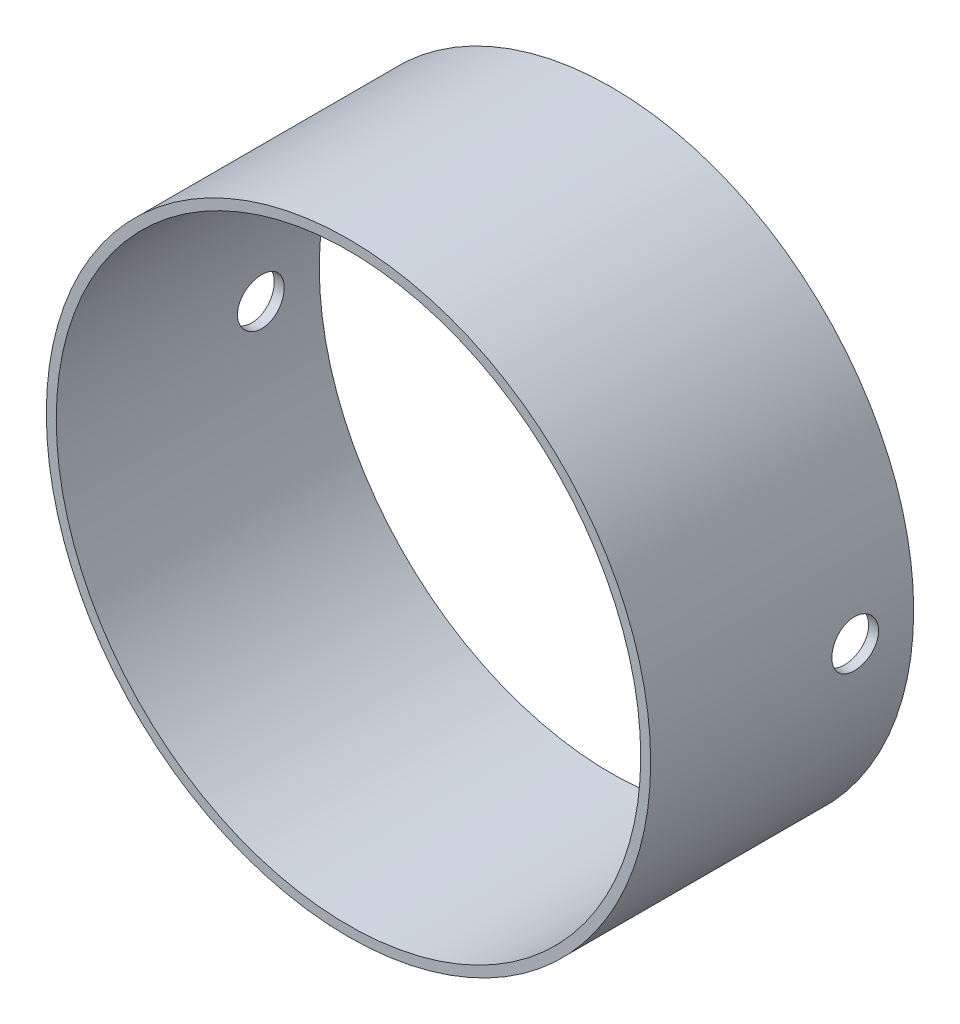
ISO-10303-21;
HEADER;
FILE_DESCRIPTION(('STEP AP214'),'2;1');
FILE_NAME('part.step','',(''),(''),'','','');
FILE_SCHEMA(('AUTOMOTIVE_DESIGN { 1 0 10303 214 1 1 1 1 }'));
ENDSEC;
DATA;
#1=APPLICATION_CONTEXT('core data for automotive mechanical design processes');
#2=APPLICATION_PROTOCOL_DEFINITION('international standard','automotive_design',2000,#1);
#3=PRODUCT_CONTEXT('',#1,'mechanical');
#4=PRODUCT('Part','Part','',(#3));
#5=PRODUCT_RELATED_PRODUCT_CATEGORY('part','',(#4));
#6=PRODUCT_DEFINITION_FORMATION('','',#4);
#7=PRODUCT_DEFINITION_CONTEXT('part definition',#1,'design');
#8=PRODUCT_DEFINITION('design','',#6,#7);
#9=PRODUCT_DEFINITION_SHAPE('','',#8);
#10=(LENGTH_UNIT() NAMED_UNIT(*) SI_UNIT(.MILLI.,.METRE.));
#11=(NAMED_UNIT(*) PLANE_ANGLE_UNIT() SI_UNIT($,.RADIAN.));
#12=(NAMED_UNIT(*) SI_UNIT($,.STERADIAN.) SOLID_ANGLE_UNIT());
#13=UNCERTAINTY_MEASURE_WITH_UNIT(LENGTH_MEASURE(1.E-05),#10,'distance_accuracy_value','');
#14=(GEOMETRIC_REPRESENTATION_CONTEXT(3) GLOBAL_UNCERTAINTY_ASSIGNED_CONTEXT((#13)) GLOBAL_UNIT_ASSIGNED_CONTEXT((#10,
#11,#12)) REPRESENTATION_CONTEXT('',''));
#15=CARTESIAN_POINT('',(0.,0.,0.));
#16=DIRECTION('',(0.,0.,1.));
#17=DIRECTION('',(1.,0.,0.));
#18=AXIS2_PLACEMENT_3D('',#15,#16,#17);
#19=CARTESIAN_POINT('',(0.,0.,-10.));
#20=DIRECTION('',(0.,0.,1.));
#21=DIRECTION('',(1.,0.,0.));
#22=AXIS2_PLACEMENT_3D('',#19,#20,#21);
#23=CYLINDRICAL_SURFACE('',#22,51.7);
#24=CARTESIAN_POINT('',(51.7,0.,4.));
#25=CARTESIAN_POINT('',(51.6999979631389,-0.224321831586067,3.99999017819331));
#26=CARTESIAN_POINT('',(51.6985244508103,-0.448797748586467,3.98106643990332));
#27=CARTESIAN_POINT('',(51.6927879875289,-0.89154273163051,3.90585232373644));
#28=CARTESIAN_POINT('',(51.6885218491458,-1.10980440749991,3.84951924675469));
#29=CARTESIAN_POINT('',(51.6776823923995,-1.53364423028132,3.70112174179197));
#30=CARTESIAN_POINT('',(51.6711103518839,-1.73922932805746,3.60907710088652));
#31=CARTESIAN_POINT('',(51.6563967875411,-2.13198086111805,3.39190366394527));
#32=CARTESIAN_POINT('',(51.6482556069983,-2.31915131151363,3.26678210200226));
#33=CARTESIAN_POINT('',(51.6312976090086,-2.67022618829929,2.98670591245437));
#34=CARTESIAN_POINT('',(51.622479496011,-2.83408419814187,2.83169317521165));
#35=CARTESIAN_POINT('',(51.6051724138657,-3.13348492470818,2.4963570088799));
#36=CARTESIAN_POINT('',(51.5966834589622,-3.26902641716669,2.31603248599858));
#37=CARTESIAN_POINT('',(51.5809815284847,-3.50810040018891,1.93491472332168));
#38=CARTESIAN_POINT('',(51.5737701627781,-3.61159262709083,1.73409615424683));
#39=CARTESIAN_POINT('',(51.5614540963383,-3.78337303081082,1.31786762642153));
#40=CARTESIAN_POINT('',(51.5563493630073,-3.85166175236816,1.10245789351319));
#41=CARTESIAN_POINT('',(51.5488349906361,-3.95096340232216,0.663622767820182));
#42=CARTESIAN_POINT('',(51.5464199322672,-3.98205129477393,0.440214432561678));
#43=CARTESIAN_POINT('',(51.5445410588577,-4.00630035100804,-0.00866144232712456));
#44=CARTESIAN_POINT('',(51.5450771953681,-3.9994621374124,-0.234128948091945));
#45=CARTESIAN_POINT('',(51.5490352256421,-3.94811511582786,-0.680210175421947));
#46=CARTESIAN_POINT('',(51.5524508869763,-3.9036876650494,-0.900833324776028));
#47=CARTESIAN_POINT('',(51.5617733022188,-3.77854963493722,-1.33148163210521));
#48=CARTESIAN_POINT('',(51.5676800775053,-3.69783874422861,-1.54150669911316));
#49=CARTESIAN_POINT('',(51.581326319149,-3.50233342665419,-1.94525695354622));
#50=CARTESIAN_POINT('',(51.5890677532469,-3.38750237083385,-2.13896433517158));
#51=CARTESIAN_POINT('',(51.6055091454228,-3.1270427974008,-2.50438588326941));
#52=CARTESIAN_POINT('',(51.614209120192,-2.98141374345625,-2.67609966665067));
#53=CARTESIAN_POINT('',(51.6316149923809,-2.66303513763778,-2.99313283619144));
#54=CARTESIAN_POINT('',(51.6403208451428,-2.49021522816072,-3.13838157800364));
#55=CARTESIAN_POINT('',(51.6567356282362,-2.12260646352011,-3.39781579055553));
#56=CARTESIAN_POINT('',(51.6644445580159,-1.92781759619756,-3.51200124410273));
#57=CARTESIAN_POINT('',(51.6779980627435,-1.52175530011905,-3.70606268143635));
#58=CARTESIAN_POINT('',(51.6838424754255,-1.31048043860398,-3.78593567927473));
#59=CARTESIAN_POINT('',(51.6930064775433,-0.877463930530638,-3.90905616202351));
#60=CARTESIAN_POINT('',(51.6963261121438,-0.655722471280415,-3.95230430210259));
#61=CARTESIAN_POINT('',(51.7000607166855,-0.208679711334541,-4.00085916917402));
#62=CARTESIAN_POINT('',(51.700483159093,0.0166109281094598,-4.00626350403786));
#63=CARTESIAN_POINT('',(51.6983957123466,0.464895177310392,-3.97923284061434));
#64=CARTESIAN_POINT('',(51.6958858467189,0.687888805482089,-3.94679814591488));
#65=CARTESIAN_POINT('',(51.6882209414929,1.12497180803664,-3.84509100035149));
#66=CARTESIAN_POINT('',(51.6830691404631,1.33907173804802,-3.7758636473271));
#67=CARTESIAN_POINT('',(51.6706993646632,1.75261644172726,-3.60258227299288));
#68=CARTESIAN_POINT('',(51.6634813616147,1.9520610147717,-3.49852777502774));
#69=CARTESIAN_POINT('',(51.6477702788731,2.33107858629529,-3.2582995400215));
#70=CARTESIAN_POINT('',(51.639274638291,2.51061038659817,-3.12206097303457));
#71=CARTESIAN_POINT('',(51.6219718914661,2.84429065387553,-2.82142578532332));
#72=CARTESIAN_POINT('',(51.6131647805584,2.99843874047784,-2.65702874272262));
#73=CARTESIAN_POINT('',(51.5962097247143,3.27730938791167,-2.30432043397325));
#74=CARTESIAN_POINT('',(51.5880632284561,3.40196837018899,-2.11595881987407));
#75=CARTESIAN_POINT('',(51.5733716018661,3.61788660029925,-1.72091962403499));
#76=CARTESIAN_POINT('',(51.5668264574495,3.7091461418991,-1.51424220341279));
#77=CARTESIAN_POINT('',(51.5560862667062,3.85556609378882,-1.08866556542602));
#78=CARTESIAN_POINT('',(51.5518886649328,3.91076576854148,-0.869779924139971));
#79=CARTESIAN_POINT('',(51.5463099727251,3.98362703629687,-0.425813470015094));
#80=CARTESIAN_POINT('',(51.5449288364902,4.00128923972315,-0.200732757979016));
#81=CARTESIAN_POINT('',(51.5451399926833,3.9985675595747,0.24860273027963));
#82=CARTESIAN_POINT('',(51.546724476832,3.97828358580493,0.472858122128244));
#83=CARTESIAN_POINT('',(51.5526717636343,3.90045330050061,0.91476757537473));
#84=CARTESIAN_POINT('',(51.5570345708104,3.8429069283109,1.13242162602643));
#85=CARTESIAN_POINT('',(51.5680448938241,3.69220988670597,1.55495899160377));
#86=CARTESIAN_POINT('',(51.5746923194864,3.59906062254085,1.7598428102007));
#87=CARTESIAN_POINT('',(51.5895229558259,3.37981369300315,2.15107949634457));
#88=CARTESIAN_POINT('',(51.5977061374797,3.25371665027832,2.33743271399128));
#89=CARTESIAN_POINT('',(51.6147117356231,2.97177904342511,2.68682879318712));
#90=CARTESIAN_POINT('',(51.6235357004448,2.81586484097398,2.84981215782555));
#91=CARTESIAN_POINT('',(51.6408146053577,2.47884533918228,3.14735751690086));
#92=CARTESIAN_POINT('',(51.649269455333,2.29773393288346,3.28191260130306));
#93=CARTESIAN_POINT('',(51.6648706384483,1.91515779363153,3.51893613312878));
#94=CARTESIAN_POINT('',(51.6720147743368,1.71365974640222,3.62135090177173));
#95=CARTESIAN_POINT('',(51.6841628980158,1.29641290866476,3.79076504479149));
#96=CARTESIAN_POINT('',(51.6891693592603,1.08068092358888,3.85780537142457));
#97=CARTESIAN_POINT('',(51.6951843410166,0.719717539238049,3.93738283901144));
#98=CARTESIAN_POINT('',(51.6969820539609,0.576811481254393,3.96083333305749));
#99=CARTESIAN_POINT('',(51.6993905389704,0.28929164456306,3.99214506345849));
#100=CARTESIAN_POINT('',(51.7000013136873,0.144677869671184,4.00000633464009));
#101=CARTESIAN_POINT('',(51.7,0.,4.));
#102=B_SPLINE_CURVE_WITH_KNOTS('',3,(#24,#25,#26,#27,#28,#29,#30,#31,#32,#33,#34,#35,#36,#37,
#38,#39,#40,#41,#42,#43,#44,#45,#46,#47,#48,#49,#50,#51,#52,#53,#54,#55,#56,#57,#58,#59,#60,#61,
#62,#63,#64,#65,#66,#67,#68,#69,#70,#71,#72,#73,#74,#75,#76,#77,#78,#79,#80,#81,#82,#83,#84,#85,
#86,#87,#88,#89,#90,#91,#92,#93,#94,#95,#96,#97,#98,#99,#100,#101),.UNSPECIFIED.,.T.,.F.,(4,2,2,
2,2,2,2,2,2,2,2,2,2,2,2,2,2,2,2,2,2,2,2,2,2,2,2,2,2,2,2,2,2,2,2,2,2,2,4),(0.,0.672437285542166,
1.34564341478563,2.01847706522499,2.69116368504895,3.3651714643236,4.0392083783108,
4.71408868496265,5.38895854819879,6.06246616658467,6.7359627282218,7.40800530863907,
8.08005365645846,8.75282608980142,9.42561024010679,10.100164782686,10.774719698608,
11.4493333039492,12.1239348411194,12.796795782868,13.4696513261953,14.1416840264236,
14.8137259246801,15.4871332699232,16.1605507051837,16.835407059956,17.5102574788435,
18.1843718439238,18.8584752466666,19.5308062767364,20.2031384012193,20.8754439914187,
21.5477368772933,22.2217120570465,22.8958508713008,23.5711096715219,24.2455850139726,
24.6792789197922,25.1129718567295),.UNSPECIFIED.);
#103=CARTESIAN_POINT('',(51.7,0.,4.));
#104=VERTEX_POINT('',#103);
#105=EDGE_CURVE('E75',#104,#104,#102,.T.);
#106=ORIENTED_EDGE('',*,*,#105,.F.);
#107=EDGE_LOOP('',(#106));
#108=FACE_BOUND('',#107,.T.);
#109=CARTESIAN_POINT('',(-51.7,0.,-4.));
#110=CARTESIAN_POINT('',(-51.6999979631389,0.224321831586067,-3.99999017819331));
#111=CARTESIAN_POINT('',(-51.6985244508103,0.448797748586467,-3.98106643990332));
#112=CARTESIAN_POINT('',(-51.6927879875289,0.89154273163051,-3.90585232373644));
#113=CARTESIAN_POINT('',(-51.6885218491458,1.10980440749991,-3.84951924675469));
#114=CARTESIAN_POINT('',(-51.6776823923995,1.53364423028132,-3.70112174179197));
#115=CARTESIAN_POINT('',(-51.6711103518839,1.73922932805746,-3.60907710088652));
#116=CARTESIAN_POINT('',(-51.6563967875411,2.13198086111805,-3.39190366394527));
#117=CARTESIAN_POINT('',(-51.6482556069983,2.31915131151363,-3.26678210200226));
#118=CARTESIAN_POINT('',(-51.6312976090086,2.67022618829929,-2.98670591245437));
#119=CARTESIAN_POINT('',(-51.622479496011,2.83408419814187,-2.83169317521165));
#120=CARTESIAN_POINT('',(-51.6051724138657,3.13348492470818,-2.4963570088799));
#121=CARTESIAN_POINT('',(-51.5966834589622,3.26902641716669,-2.31603248599858));
#122=CARTESIAN_POINT('',(-51.5809815284847,3.50810040018891,-1.93491472332168));
#123=CARTESIAN_POINT('',(-51.5737701627781,3.61159262709083,-1.73409615424683));
#124=CARTESIAN_POINT('',(-51.5614540963383,3.78337303081082,-1.31786762642153));
#125=CARTESIAN_POINT('',(-51.5563493630073,3.85166175236816,-1.10245789351319));
#126=CARTESIAN_POINT('',(-51.5488349906361,3.95096340232216,-0.663622767820182));
#127=CARTESIAN_POINT('',(-51.5464199322672,3.98205129477393,-0.440214432561678));
#128=CARTESIAN_POINT('',(-51.5445410588577,4.00630035100804,0.00866144232712456));
#129=CARTESIAN_POINT('',(-51.5450771953681,3.9994621374124,0.234128948091945));
#130=CARTESIAN_POINT('',(-51.5490352256421,3.94811511582786,0.680210175421947));
#131=CARTESIAN_POINT('',(-51.5524508869763,3.9036876650494,0.900833324776028));
#132=CARTESIAN_POINT('',(-51.5617733022188,3.77854963493722,1.33148163210521));
#133=CARTESIAN_POINT('',(-51.5676800775053,3.69783874422861,1.54150669911316));
#134=CARTESIAN_POINT('',(-51.581326319149,3.50233342665419,1.94525695354622));
#135=CARTESIAN_POINT('',(-51.5890677532469,3.38750237083385,2.13896433517158));
#136=CARTESIAN_POINT('',(-51.6055091454228,3.1270427974008,2.50438588326941));
#137=CARTESIAN_POINT('',(-51.614209120192,2.98141374345625,2.67609966665067));
#138=CARTESIAN_POINT('',(-51.6316149923809,2.66303513763778,2.99313283619144));
#139=CARTESIAN_POINT('',(-51.6403208451428,2.49021522816072,3.13838157800364));
#140=CARTESIAN_POINT('',(-51.6567356282362,2.12260646352011,3.39781579055553));
#141=CARTESIAN_POINT('',(-51.6644445580159,1.92781759619756,3.51200124410273));
#142=CARTESIAN_POINT('',(-51.6779980627435,1.52175530011905,3.70606268143635));
#143=CARTESIAN_POINT('',(-51.6838424754255,1.31048043860398,3.78593567927473));
#144=CARTESIAN_POINT('',(-51.6930064775433,0.877463930530638,3.90905616202351));
#145=CARTESIAN_POINT('',(-51.6963261121438,0.655722471280415,3.95230430210259));
#146=CARTESIAN_POINT('',(-51.7000607166855,0.208679711334541,4.00085916917402));
#147=CARTESIAN_POINT('',(-51.700483159093,-0.0166109281094598,4.00626350403786));
#148=CARTESIAN_POINT('',(-51.6983957123466,-0.464895177310392,3.97923284061434));
#149=CARTESIAN_POINT('',(-51.6958858467189,-0.687888805482089,3.94679814591488));
#150=CARTESIAN_POINT('',(-51.6882209414929,-1.12497180803664,3.84509100035149));
#151=CARTESIAN_POINT('',(-51.6830691404631,-1.33907173804802,3.7758636473271));
#152=CARTESIAN_POINT('',(-51.6706993646632,-1.75261644172726,3.60258227299288));
#153=CARTESIAN_POINT('',(-51.6634813616147,-1.9520610147717,3.49852777502774));
#154=CARTESIAN_POINT('',(-51.6477702788731,-2.33107858629529,3.2582995400215));
#155=CARTESIAN_POINT('',(-51.639274638291,-2.51061038659817,3.12206097303457));
#156=CARTESIAN_POINT('',(-51.6219718914661,-2.84429065387553,2.82142578532332));
#157=CARTESIAN_POINT('',(-51.6131647805584,-2.99843874047784,2.65702874272262));
#158=CARTESIAN_POINT('',(-51.5962097247143,-3.27730938791167,2.30432043397325));
#159=CARTESIAN_POINT('',(-51.5880632284561,-3.40196837018899,2.11595881987407));
#160=CARTESIAN_POINT('',(-51.5733716018661,-3.61788660029925,1.72091962403499));
#161=CARTESIAN_POINT('',(-51.5668264574495,-3.7091461418991,1.51424220341279));
#162=CARTESIAN_POINT('',(-51.5560862667062,-3.85556609378882,1.08866556542602));
#163=CARTESIAN_POINT('',(-51.5518886649328,-3.91076576854148,0.869779924139971));
#164=CARTESIAN_POINT('',(-51.5463099727251,-3.98362703629687,0.425813470015094));
#165=CARTESIAN_POINT('',(-51.5449288364902,-4.00128923972315,0.200732757979016));
#166=CARTESIAN_POINT('',(-51.5451399926833,-3.9985675595747,-0.24860273027963));
#167=CARTESIAN_POINT('',(-51.546724476832,-3.97828358580493,-0.472858122128244));
#168=CARTESIAN_POINT('',(-51.5526717636343,-3.90045330050061,-0.91476757537473));
#169=CARTESIAN_POINT('',(-51.5570345708104,-3.8429069283109,-1.13242162602643));
#170=CARTESIAN_POINT('',(-51.5680448938241,-3.69220988670597,-1.55495899160377));
#171=CARTESIAN_POINT('',(-51.5746923194864,-3.59906062254085,-1.7598428102007));
#172=CARTESIAN_POINT('',(-51.5895229558259,-3.37981369300315,-2.15107949634457));
#173=CARTESIAN_POINT('',(-51.5977061374797,-3.25371665027832,-2.33743271399128));
#174=CARTESIAN_POINT('',(-51.6147117356231,-2.97177904342511,-2.68682879318712));
#175=CARTESIAN_POINT('',(-51.6235357004448,-2.81586484097398,-2.84981215782555));
#176=CARTESIAN_POINT('',(-51.6408146053577,-2.47884533918228,-3.14735751690086));
#177=CARTESIAN_POINT('',(-51.649269455333,-2.29773393288346,-3.28191260130306));
#178=CARTESIAN_POINT('',(-51.6648706384483,-1.91515779363153,-3.51893613312878));
#179=CARTESIAN_POINT('',(-51.6720147743368,-1.71365974640222,-3.62135090177173));
#180=CARTESIAN_POINT('',(-51.6841628980158,-1.29641290866476,-3.79076504479149));
#181=CARTESIAN_POINT('',(-51.6891693592603,-1.08068092358888,-3.85780537142457));
#182=CARTESIAN_POINT('',(-51.6951843410166,-0.719717539238049,-3.93738283901144));
#183=CARTESIAN_POINT('',(-51.6969820539609,-0.576811481254393,-3.96083333305749));
#184=CARTESIAN_POINT('',(-51.6993905389704,-0.28929164456306,-3.99214506345849));
#185=CARTESIAN_POINT('',(-51.7000013136873,-0.144677869671184,-4.00000633464009));
#186=CARTESIAN_POINT('',(-51.7,0.,-4.));
#187=B_SPLINE_CURVE_WITH_KNOTS('',3,(#109,#110,#111,#112,#113,#114,#115,#116,#117,#118,#119,
#120,#121,#122,#123,#124,#125,#126,#127,#128,#129,#130,#131,#132,#133,#134,#135,#136,#137,#138,
#139,#140,#141,#142,#143,#144,#145,#146,#147,#148,#149,#150,#151,#152,#153,#154,#155,#156,#157,
#158,#159,#160,#161,#162,#163,#164,#165,#166,#167,#168,#169,#170,#171,#172,#173,#174,#175,#176,
#177,#178,#179,#180,#181,#182,#183,#184,#185,#186),.UNSPECIFIED.,.T.,.F.,(4,2,2,2,2,2,2,2,2,2,2,
2,2,2,2,2,2,2,2,2,2,2,2,2,2,2,2,2,2,2,2,2,2,2,2,2,2,2,4),(0.,0.672437285542166,1.34564341478563,
2.01847706522499,2.69116368504895,3.3651714643236,4.0392083783108,4.71408868496265,
5.38895854819879,6.06246616658467,6.7359627282218,7.40800530863907,8.08005365645846,
8.75282608980142,9.42561024010679,10.100164782686,10.774719698608,11.4493333039492,
12.1239348411194,12.796795782868,13.4696513261953,14.1416840264236,14.8137259246801,
15.4871332699232,16.1605507051837,16.835407059956,17.5102574788435,18.1843718439238,
18.8584752466666,19.5308062767364,20.2031384012193,20.8754439914187,21.5477368772933,
22.2217120570465,22.8958508713008,23.5711096715219,24.2455850139726,24.6792789197922,
25.1129718567295),.UNSPECIFIED.);
#188=CARTESIAN_POINT('',(-51.7,0.,-4.));
#189=VERTEX_POINT('',#188);
#190=EDGE_CURVE('E53',#189,#189,#187,.T.);
#191=ORIENTED_EDGE('',*,*,#190,.T.);
#192=EDGE_LOOP('',(#191));
#193=FACE_BOUND('',#192,.T.);
#194=CARTESIAN_POINT('',(0.,0.,-10.));
#195=DIRECTION('',(0.,0.,1.));
#196=DIRECTION('',(1.,0.,0.));
#197=AXIS2_PLACEMENT_3D('',#194,#195,#196);
#198=CIRCLE('',#197,51.7);
#199=CARTESIAN_POINT('',(51.7,0.,-10.));
#200=VERTEX_POINT('',#199);
#201=EDGE_CURVE('E10',#200,#200,#198,.T.);
#202=ORIENTED_EDGE('',*,*,#201,.T.);
#203=EDGE_LOOP('',(#202));
#204=FACE_BOUND('',#203,.T.);
#205=CARTESIAN_POINT('',(0.,0.,35.));
#206=DIRECTION('',(0.,0.,1.));
#207=DIRECTION('',(1.,0.,0.));
#208=AXIS2_PLACEMENT_3D('',#205,#206,#207);
#209=CIRCLE('',#208,51.7);
#210=CARTESIAN_POINT('',(51.7,0.,35.));
#211=VERTEX_POINT('',#210);
#212=EDGE_CURVE('E46',#211,#211,#209,.T.);
#213=ORIENTED_EDGE('',*,*,#212,.F.);
#214=EDGE_LOOP('',(#213));
#215=FACE_BOUND('',#214,.T.);
#216=ADVANCED_FACE('F30',(#108,#193,#204,#215),#23,.T.);
#217=CARTESIAN_POINT('',(0.,0.,-10.));
#218=DIRECTION('',(0.,0.,1.));
#219=DIRECTION('',(1.,0.,0.));
#220=AXIS2_PLACEMENT_3D('',#217,#218,#219);
#221=PLANE('',#220);
#222=CARTESIAN_POINT('',(0.,0.,-10.));
#223=DIRECTION('',(0.,0.,1.));
#224=DIRECTION('',(1.,0.,0.));
#225=AXIS2_PLACEMENT_3D('',#222,#223,#224);
#226=CIRCLE('',#225,50.);
#227=CARTESIAN_POINT('',(50.,0.,-10.));
#228=VERTEX_POINT('',#227);
#229=EDGE_CURVE('E41',#228,#228,#226,.T.);
#230=ORIENTED_EDGE('',*,*,#229,.T.);
#231=EDGE_LOOP('',(#230));
#232=FACE_BOUND('',#231,.T.);
#233=ORIENTED_EDGE('',*,*,#201,.F.);
#234=EDGE_LOOP('',(#233));
#235=FACE_BOUND('',#234,.T.);
#236=ADVANCED_FACE('F87',(#232,#235),#221,.F.);
#237=CARTESIAN_POINT('',(0.,0.,-10.));
#238=DIRECTION('',(0.,0.,1.));
#239=DIRECTION('',(1.,0.,0.));
#240=AXIS2_PLACEMENT_3D('',#237,#238,#239);
#241=CYLINDRICAL_SURFACE('',#240,50.);
#242=CARTESIAN_POINT('',(50.,0.,-4.));
#243=CARTESIAN_POINT('',(49.999997898146,0.224297002401181,-3.99999018950861));
#244=CARTESIAN_POINT('',(49.998474626879,0.448747478653655,-3.98107062248397));
#245=CARTESIAN_POINT('',(49.9925444512797,0.891440580759888,-3.90587404268197));
#246=CARTESIAN_POINT('',(49.9881342640617,1.10967584374537,-3.84955449908534));
#247=CARTESIAN_POINT('',(49.9769287256558,1.53346272002718,-3.70119503798359));
#248=CARTESIAN_POINT('',(49.97013470793,1.73902134892547,-3.60917508746047));
#249=CARTESIAN_POINT('',(49.9549238190758,2.13172513610842,-3.39206206370655));
#250=CARTESIAN_POINT('',(49.9465072995693,2.31887427077513,-3.26697615421763));
#251=CARTESIAN_POINT('',(49.9289739182172,2.66993840145839,-2.9869624710949));
#252=CARTESIAN_POINT('',(49.9198556282099,2.83380397693842,-2.8319728210047));
#253=CARTESIAN_POINT('',(49.9019584108994,3.13322560265374,-2.49668160543985));
#254=CARTESIAN_POINT('',(49.8931794983837,3.26878042043986,-2.31637893858748));
#255=CARTESIAN_POINT('',(49.8769394254638,3.50789797644633,-1.93528308834079));
#256=CARTESIAN_POINT('',(49.8694800470414,3.61141759149095,-1.73446276498295));
#257=CARTESIAN_POINT('',(49.8567395802142,3.78325068479296,-1.31822147741494));
#258=CARTESIAN_POINT('',(49.8514584560456,3.85156474107912,-1.10280075298978));
#259=CARTESIAN_POINT('',(49.8436841845592,3.95090498118926,-0.663966483956863));
#260=CARTESIAN_POINT('',(49.8411850466748,3.98201129680184,-0.440571186887996));
#261=CARTESIAN_POINT('',(49.8392386754776,4.00630058138917,0.00828269894637297));
#262=CARTESIAN_POINT('',(49.8397913889656,3.99948421142467,0.233741251677212));
#263=CARTESIAN_POINT('',(49.8438808364724,3.94818788356081,0.679773133888386));
#264=CARTESIAN_POINT('',(49.8474106761184,3.90379494392039,0.900356543023491));
#265=CARTESIAN_POINT('',(49.8570458184827,3.77874078259934,1.33093115935201));
#266=CARTESIAN_POINT('',(49.8631511446229,3.69807923108508,1.54092227019774));
#267=CARTESIAN_POINT('',(49.8772572586443,3.50267985746596,1.94462913767884));
#268=CARTESIAN_POINT('',(49.8852602203243,3.38790291663927,2.13832588130852));
#269=CARTESIAN_POINT('',(49.9022578116024,3.12755908324023,2.50373776842757));
#270=CARTESIAN_POINT('',(49.9112524596847,2.98199161671361,2.67545250206301));
#271=CARTESIAN_POINT('',(49.929250585107,2.66371043190185,2.99253204007724));
#272=CARTESIAN_POINT('',(49.9382540160585,2.490921471053,3.13782133010002));
#273=CARTESIAN_POINT('',(49.9552310648066,2.12336486840713,3.39734213973551));
#274=CARTESIAN_POINT('',(49.9632046819839,1.92859721339218,3.51157364067002));
#275=CARTESIAN_POINT('',(49.9772250248471,1.5225634616852,3.70573125762878));
#276=CARTESIAN_POINT('',(49.9832715675338,1.31129580048739,3.78565411588016));
#277=CARTESIAN_POINT('',(49.9927543192272,0.878281304152876,3.90887329669823));
#278=CARTESIAN_POINT('',(49.9961905781579,0.656534669522683,3.95217031977071));
#279=CARTESIAN_POINT('',(50.0000591742551,0.20951145738511,4.00081430789077));
#280=CARTESIAN_POINT('',(50.0004997689923,-0.0157536995731637,4.00626559586637));
#281=CARTESIAN_POINT('',(49.9983494312892,-0.463994796578853,3.97933653424578));
#282=CARTESIAN_POINT('',(49.995758524878,-0.68697075626531,3.9469565094788));
#283=CARTESIAN_POINT('',(49.9878419251379,-1.12400717214071,3.84537042315455));
#284=CARTESIAN_POINT('',(49.9825198165682,-1.33807891812841,3.77621262887326));
#285=CARTESIAN_POINT('',(49.9697388357816,-1.75157968857889,3.60308338728268));
#286=CARTESIAN_POINT('',(49.9622799323535,-1.95100849910627,3.49911143145687));
#287=CARTESIAN_POINT('',(49.9460412644974,-2.33003763802838,3.25904247389295));
#288=CARTESIAN_POINT('',(49.9372586692755,-2.50959400516879,3.12287625903469));
#289=CARTESIAN_POINT('',(49.9193691601784,-2.84333776745149,2.82238415895546));
#290=CARTESIAN_POINT('',(49.9102622411115,-2.99752475626729,2.65805782279633));
#291=CARTESIAN_POINT('',(49.8927261315226,-3.27651001115834,2.30545786607944));
#292=CARTESIAN_POINT('',(49.8842985383096,-3.40124027084595,2.11713034687763));
#293=CARTESIAN_POINT('',(49.8690974817448,-3.61730534228237,1.72214269322549));
#294=CARTESIAN_POINT('',(49.8623240029919,-3.70864046496762,1.51548272948769));
#295=CARTESIAN_POINT('',(49.8512067763447,-3.85520640260643,1.08993866332864));
#296=CARTESIAN_POINT('',(49.846860213588,-3.91047905727015,0.871069047877115));
#297=CARTESIAN_POINT('',(49.8410793484241,-3.98348737085161,0.427119702558651));
#298=CARTESIAN_POINT('',(49.8396449949634,-4.00122368781458,0.202040081628684));
#299=CARTESIAN_POINT('',(49.8398516171461,-3.99864850934075,-0.247264214894314));
#300=CARTESIAN_POINT('',(49.8414839554061,-3.97844387523982,-0.471489514691057));
#301=CARTESIAN_POINT('',(49.8476216930852,-3.90078293179813,-0.913351603725394));
#302=CARTESIAN_POINT('',(49.8521270970574,-3.84332656341968,-1.13098838252072));
#303=CARTESIAN_POINT('',(49.8635010625076,-3.69281971615259,-1.55350398156926));
#304=CARTESIAN_POINT('',(49.8703695118819,-3.59977092575626,-1.75838340649091));
#305=CARTESIAN_POINT('',(49.8856958040866,-3.38073283535255,-2.14962980243443));
#306=CARTESIAN_POINT('',(49.8941536190818,-3.25474411222037,-2.33599709757931));
#307=CARTESIAN_POINT('',(49.9117339081692,-2.97300144621754,-2.68547535891871));
#308=CARTESIAN_POINT('',(49.9208581041528,-2.81716857393022,-2.84852260661499));
#309=CARTESIAN_POINT('',(49.9387274318582,-2.48030030729157,-3.14621036924122));
#310=CARTESIAN_POINT('',(49.9474724711464,-2.29925881219966,-3.28084398788555));
#311=CARTESIAN_POINT('',(49.9636126808607,-1.91678954746826,-3.51804830826757));
#312=CARTESIAN_POINT('',(49.9710054658247,-1.71532670765956,-3.6205625721955));
#313=CARTESIAN_POINT('',(49.9835796818237,-1.29812785280964,-3.79017907795963));
#314=CARTESIAN_POINT('',(49.9887636620621,-1.0824086253029,-3.857322163302));
#315=CARTESIAN_POINT('',(49.995000390113,-0.72117345690686,-3.9371272615902));
#316=CARTESIAN_POINT('',(49.9968667452072,-0.57798292225704,-3.96067335424587));
#317=CARTESIAN_POINT('',(49.9993672279264,-0.289882960898438,-3.99211287504859));
#318=CARTESIAN_POINT('',(50.0000013585256,-0.144973538339215,-4.00000634097484));
#319=CARTESIAN_POINT('',(50.,0.,-4.));
#320=B_SPLINE_CURVE_WITH_KNOTS('',3,(#242,#243,#244,#245,#246,#247,#248,#249,#250,#251,#252,
#253,#254,#255,#256,#257,#258,#259,#260,#261,#262,#263,#264,#265,#266,#267,#268,#269,#270,#271,
#272,#273,#274,#275,#276,#277,#278,#279,#280,#281,#282,#283,#284,#285,#286,#287,#288,#289,#290,
#291,#292,#293,#294,#295,#296,#297,#298,#299,#300,#301,#302,#303,#304,#305,#306,#307,#308,#309,
#310,#311,#312,#313,#314,#315,#316,#317,#318,#319),.UNSPECIFIED.,.T.,.F.,(4,2,2,2,2,2,2,2,2,2,2,
2,2,2,2,2,2,2,2,2,2,2,2,2,2,2,2,2,2,2,2,2,2,2,2,2,2,2,4),(0.,0.672361708488848,1.34548933126205,
2.01824102004861,2.69084707642794,3.36486010333084,4.03890246585727,4.7138482615338,
5.38878297513908,6.06226149534334,6.73572827563998,7.40763972289986,8.07955728077347,
8.75224829099393,9.42495184169229,10.0995485258591,10.7741456157287,11.4488067477188,
12.1234549758474,12.7962427744497,13.4690247963687,14.1409260279387,14.8128370741292,
15.4862059840921,16.1595856779617,16.834505120977,17.5094182797724,18.1835470046478,
18.857663911352,19.5298850035176,20.2021071610425,20.874297432533,21.5464759327815,
22.2204573393883,22.8946021406973,23.5699249421673,24.244466221842,24.679045775495,
25.1136242802451),.UNSPECIFIED.);
#321=CARTESIAN_POINT('',(50.,0.,-4.));
#322=VERTEX_POINT('',#321);
#323=EDGE_CURVE('E33',#322,#322,#320,.T.);
#324=ORIENTED_EDGE('',*,*,#323,.T.);
#325=EDGE_LOOP('',(#324));
#326=FACE_BOUND('',#325,.T.);
#327=CARTESIAN_POINT('',(-50.,0.,-4.));
#328=CARTESIAN_POINT('',(-49.999997898146,-0.224297002401181,-3.99999018950861));
#329=CARTESIAN_POINT('',(-49.998474626879,-0.448747478653655,-3.98107062248397));
#330=CARTESIAN_POINT('',(-49.9925444512797,-0.891440580759888,-3.90587404268197));
#331=CARTESIAN_POINT('',(-49.9881342640617,-1.10967584374537,-3.84955449908534));
#332=CARTESIAN_POINT('',(-49.9769287256558,-1.53346272002718,-3.70119503798359));
#333=CARTESIAN_POINT('',(-49.97013470793,-1.73902134892547,-3.60917508746047));
#334=CARTESIAN_POINT('',(-49.9549238190758,-2.13172513610842,-3.39206206370655));
#335=CARTESIAN_POINT('',(-49.9465072995693,-2.31887427077513,-3.26697615421763));
#336=CARTESIAN_POINT('',(-49.9289739182172,-2.66993840145839,-2.9869624710949));
#337=CARTESIAN_POINT('',(-49.9198556282099,-2.83380397693842,-2.8319728210047));
#338=CARTESIAN_POINT('',(-49.9019584108994,-3.13322560265374,-2.49668160543985));
#339=CARTESIAN_POINT('',(-49.8931794983837,-3.26878042043986,-2.31637893858748));
#340=CARTESIAN_POINT('',(-49.8769394254638,-3.50789797644633,-1.93528308834079));
#341=CARTESIAN_POINT('',(-49.8694800470414,-3.61141759149095,-1.73446276498295));
#342=CARTESIAN_POINT('',(-49.8567395802142,-3.78325068479296,-1.31822147741494));
#343=CARTESIAN_POINT('',(-49.8514584560456,-3.85156474107912,-1.10280075298978));
#344=CARTESIAN_POINT('',(-49.8436841845592,-3.95090498118926,-0.663966483956863));
#345=CARTESIAN_POINT('',(-49.8411850466748,-3.98201129680184,-0.440571186887996));
#346=CARTESIAN_POINT('',(-49.8392386754776,-4.00630058138917,0.00828269894637297));
#347=CARTESIAN_POINT('',(-49.8397913889656,-3.99948421142467,0.233741251677212));
#348=CARTESIAN_POINT('',(-49.8438808364724,-3.94818788356081,0.679773133888386));
#349=CARTESIAN_POINT('',(-49.8474106761184,-3.90379494392039,0.900356543023491));
#350=CARTESIAN_POINT('',(-49.8570458184827,-3.77874078259934,1.33093115935201));
#351=CARTESIAN_POINT('',(-49.8631511446229,-3.69807923108508,1.54092227019774));
#352=CARTESIAN_POINT('',(-49.8772572586443,-3.50267985746596,1.94462913767884));
#353=CARTESIAN_POINT('',(-49.8852602203243,-3.38790291663927,2.13832588130852));
#354=CARTESIAN_POINT('',(-49.9022578116024,-3.12755908324023,2.50373776842757));
#355=CARTESIAN_POINT('',(-49.9112524596847,-2.98199161671361,2.67545250206301));
#356=CARTESIAN_POINT('',(-49.929250585107,-2.66371043190185,2.99253204007724));
#357=CARTESIAN_POINT('',(-49.9382540160585,-2.490921471053,3.13782133010002));
#358=CARTESIAN_POINT('',(-49.9552310648066,-2.12336486840713,3.39734213973551));
#359=CARTESIAN_POINT('',(-49.9632046819839,-1.92859721339218,3.51157364067002));
#360=CARTESIAN_POINT('',(-49.9772250248471,-1.5225634616852,3.70573125762878));
#361=CARTESIAN_POINT('',(-49.9832715675338,-1.31129580048739,3.78565411588016));
#362=CARTESIAN_POINT('',(-49.9927543192272,-0.878281304152876,3.90887329669823));
#363=CARTESIAN_POINT('',(-49.9961905781579,-0.656534669522683,3.95217031977071));
#364=CARTESIAN_POINT('',(-50.0000591742551,-0.20951145738511,4.00081430789077));
#365=CARTESIAN_POINT('',(-50.0004997689923,0.0157536995731637,4.00626559586637));
#366=CARTESIAN_POINT('',(-49.9983494312892,0.463994796578853,3.97933653424578));
#367=CARTESIAN_POINT('',(-49.995758524878,0.68697075626531,3.9469565094788));
#368=CARTESIAN_POINT('',(-49.9878419251379,1.12400717214071,3.84537042315455));
#369=CARTESIAN_POINT('',(-49.9825198165682,1.33807891812841,3.77621262887326));
#370=CARTESIAN_POINT('',(-49.9697388357816,1.75157968857889,3.60308338728268));
#371=CARTESIAN_POINT('',(-49.9622799323535,1.95100849910627,3.49911143145687));
#372=CARTESIAN_POINT('',(-49.9460412644974,2.33003763802838,3.25904247389295));
#373=CARTESIAN_POINT('',(-49.9372586692755,2.50959400516879,3.12287625903469));
#374=CARTESIAN_POINT('',(-49.9193691601784,2.84333776745149,2.82238415895546));
#375=CARTESIAN_POINT('',(-49.9102622411115,2.99752475626729,2.65805782279633));
#376=CARTESIAN_POINT('',(-49.8927261315226,3.27651001115834,2.30545786607944));
#377=CARTESIAN_POINT('',(-49.8842985383096,3.40124027084595,2.11713034687763));
#378=CARTESIAN_POINT('',(-49.8690974817448,3.61730534228237,1.72214269322549));
#379=CARTESIAN_POINT('',(-49.8623240029919,3.70864046496762,1.51548272948769));
#380=CARTESIAN_POINT('',(-49.8512067763447,3.85520640260643,1.08993866332864));
#381=CARTESIAN_POINT('',(-49.846860213588,3.91047905727015,0.871069047877115));
#382=CARTESIAN_POINT('',(-49.8410793484241,3.98348737085161,0.427119702558651));
#383=CARTESIAN_POINT('',(-49.8396449949634,4.00122368781458,0.202040081628684));
#384=CARTESIAN_POINT('',(-49.8398516171461,3.99864850934075,-0.247264214894314));
#385=CARTESIAN_POINT('',(-49.8414839554061,3.97844387523982,-0.471489514691057));
#386=CARTESIAN_POINT('',(-49.8476216930852,3.90078293179813,-0.913351603725394));
#387=CARTESIAN_POINT('',(-49.8521270970574,3.84332656341968,-1.13098838252072));
#388=CARTESIAN_POINT('',(-49.8635010625076,3.69281971615259,-1.55350398156926));
#389=CARTESIAN_POINT('',(-49.8703695118819,3.59977092575626,-1.75838340649091));
#390=CARTESIAN_POINT('',(-49.8856958040866,3.38073283535255,-2.14962980243443));
#391=CARTESIAN_POINT('',(-49.8941536190818,3.25474411222037,-2.33599709757931));
#392=CARTESIAN_POINT('',(-49.9117339081692,2.97300144621754,-2.68547535891871));
#393=CARTESIAN_POINT('',(-49.9208581041528,2.81716857393022,-2.84852260661499));
#394=CARTESIAN_POINT('',(-49.9387274318582,2.48030030729157,-3.14621036924122));
#395=CARTESIAN_POINT('',(-49.9474724711464,2.29925881219966,-3.28084398788555));
#396=CARTESIAN_POINT('',(-49.9636126808607,1.91678954746826,-3.51804830826757));
#397=CARTESIAN_POINT('',(-49.9710054658247,1.71532670765956,-3.6205625721955));
#398=CARTESIAN_POINT('',(-49.9835796818237,1.29812785280964,-3.79017907795963));
#399=CARTESIAN_POINT('',(-49.9887636620621,1.0824086253029,-3.857322163302));
#400=CARTESIAN_POINT('',(-49.995000390113,0.72117345690686,-3.9371272615902));
#401=CARTESIAN_POINT('',(-49.9968667452072,0.57798292225704,-3.96067335424587));
#402=CARTESIAN_POINT('',(-49.9993672279264,0.289882960898438,-3.99211287504859));
#403=CARTESIAN_POINT('',(-50.0000013585256,0.144973538339215,-4.00000634097484));
#404=CARTESIAN_POINT('',(-50.,0.,-4.));
#405=B_SPLINE_CURVE_WITH_KNOTS('',3,(#327,#328,#329,#330,#331,#332,#333,#334,#335,#336,#337,
#338,#339,#340,#341,#342,#343,#344,#345,#346,#347,#348,#349,#350,#351,#352,#353,#354,#355,#356,
#357,#358,#359,#360,#361,#362,#363,#364,#365,#366,#367,#368,#369,#370,#371,#372,#373,#374,#375,
#376,#377,#378,#379,#380,#381,#382,#383,#384,#385,#386,#387,#388,#389,#390,#391,#392,#393,#394,
#395,#396,#397,#398,#399,#400,#401,#402,#403,#404),.UNSPECIFIED.,.T.,.F.,(4,2,2,2,2,2,2,2,2,2,2,
2,2,2,2,2,2,2,2,2,2,2,2,2,2,2,2,2,2,2,2,2,2,2,2,2,2,2,4),(0.,0.672361708488848,1.34548933126205,
2.01824102004861,2.69084707642794,3.36486010333084,4.03890246585727,4.7138482615338,
5.38878297513908,6.06226149534334,6.73572827563998,7.40763972289986,8.07955728077347,
8.75224829099393,9.42495184169229,10.0995485258591,10.7741456157287,11.4488067477188,
12.1234549758474,12.7962427744497,13.4690247963687,14.1409260279387,14.8128370741292,
15.4862059840921,16.1595856779617,16.834505120977,17.5094182797724,18.1835470046478,
18.857663911352,19.5298850035176,20.2021071610425,20.874297432533,21.5464759327815,
22.2204573393883,22.8946021406973,23.5699249421673,24.244466221842,24.679045775495,
25.1136242802451),.UNSPECIFIED.);
#406=CARTESIAN_POINT('',(-50.,0.,-4.));
#407=VERTEX_POINT('',#406);
#408=EDGE_CURVE('E49',#407,#407,#405,.T.);
#409=ORIENTED_EDGE('',*,*,#408,.T.);
#410=EDGE_LOOP('',(#409));
#411=FACE_BOUND('',#410,.T.);
#412=ORIENTED_EDGE('',*,*,#229,.F.);
#413=EDGE_LOOP('',(#412));
#414=FACE_BOUND('',#413,.T.);
#415=CARTESIAN_POINT('',(0.,0.,35.));
#416=DIRECTION('',(0.,0.,1.));
#417=DIRECTION('',(1.,0.,0.));
#418=AXIS2_PLACEMENT_3D('',#415,#416,#417);
#419=CIRCLE('',#418,50.);
#420=CARTESIAN_POINT('',(50.,0.,35.));
#421=VERTEX_POINT('',#420);
#422=EDGE_CURVE('E78',#421,#421,#419,.T.);
#423=ORIENTED_EDGE('',*,*,#422,.T.);
#424=EDGE_LOOP('',(#423));
#425=FACE_BOUND('',#424,.T.);
#426=ADVANCED_FACE('F54',(#326,#411,#414,#425),#241,.F.);
#427=CARTESIAN_POINT('',(0.,0.,35.));
#428=DIRECTION('',(0.,0.,1.));
#429=DIRECTION('',(1.,0.,0.));
#430=AXIS2_PLACEMENT_3D('',#427,#428,#429);
#431=PLANE('',#430);
#432=ORIENTED_EDGE('',*,*,#212,.T.);
#433=EDGE_LOOP('',(#432));
#434=FACE_BOUND('',#433,.T.);
#435=ORIENTED_EDGE('',*,*,#422,.F.);
#436=EDGE_LOOP('',(#435));
#437=FACE_BOUND('',#436,.T.);
#438=ADVANCED_FACE('F83',(#434,#437),#431,.T.);
#439=CARTESIAN_POINT('',(-51.701,0.,0.));
#440=DIRECTION('',(1.,0.,0.));
#441=DIRECTION('',(0.,0.,-1.));
#442=AXIS2_PLACEMENT_3D('',#439,#440,#441);
#443=CYLINDRICAL_SURFACE('',#442,4.);
#444=ORIENTED_EDGE('',*,*,#190,.F.);
#445=EDGE_LOOP('',(#444));
#446=FACE_BOUND('',#445,.T.);
#447=ORIENTED_EDGE('',*,*,#408,.F.);
#448=EDGE_LOOP('',(#447));
#449=FACE_BOUND('',#448,.T.);
#450=ADVANCED_FACE('F62',(#446,#449),#443,.F.);
#451=ORIENTED_EDGE('',*,*,#105,.T.);
#452=EDGE_LOOP('',(#451));
#453=FACE_BOUND('',#452,.T.);
#454=ORIENTED_EDGE('',*,*,#323,.F.);
#455=EDGE_LOOP('',(#454));
#456=FACE_BOUND('',#455,.T.);
#457=ADVANCED_FACE('F57',(#453,#456),#443,.F.);
#458=CLOSED_SHELL('',(#216,#236,#426,#438,#450,#457));
#459=MANIFOLD_SOLID_BREP('B2',#458);
#460=ADVANCED_BREP_SHAPE_REPRESENTATION('',(#18,#459),#14);
#461=SHAPE_DEFINITION_REPRESENTATION(#9,#460);
ENDSEC;
END-ISO-10303-21;
